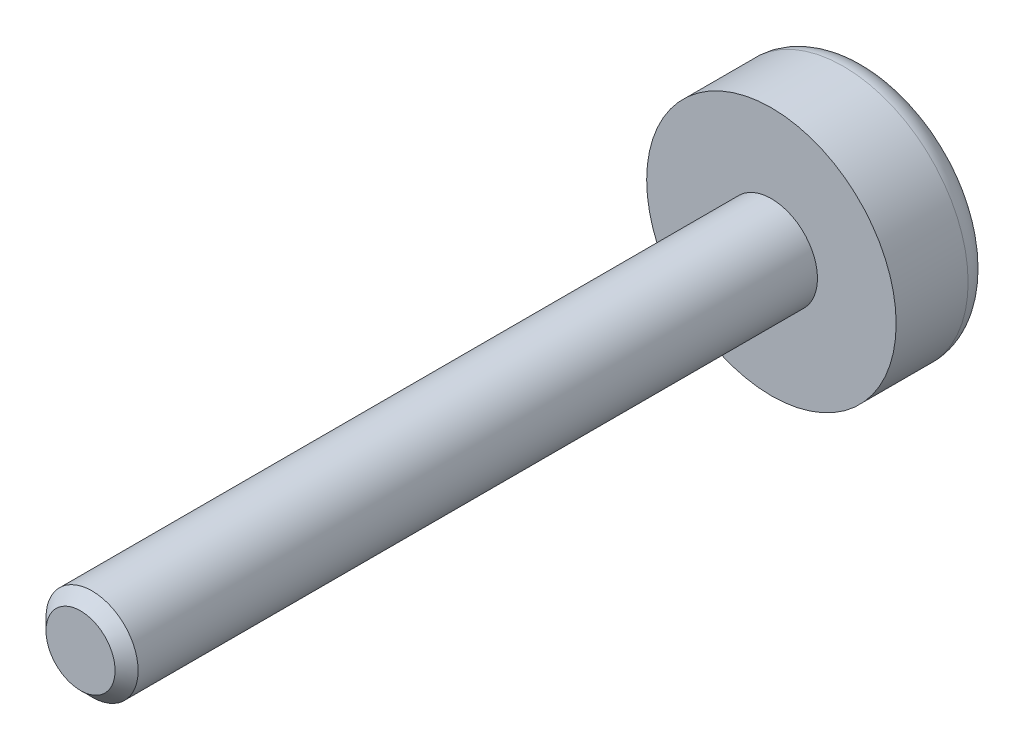
ISO-10303-21;
HEADER;
FILE_DESCRIPTION(('STEP AP214'),'2;1');
FILE_NAME('part.step','',(''),(''),'','','');
FILE_SCHEMA(('AUTOMOTIVE_DESIGN { 1 0 10303 214 1 1 1 1 }'));
ENDSEC;
DATA;
#1=APPLICATION_CONTEXT('core data for automotive mechanical design processes');
#2=APPLICATION_PROTOCOL_DEFINITION('international standard','automotive_design',2000,#1);
#3=PRODUCT_CONTEXT('',#1,'mechanical');
#4=PRODUCT('Part','Part','',(#3));
#5=PRODUCT_RELATED_PRODUCT_CATEGORY('part','',(#4));
#6=PRODUCT_DEFINITION_FORMATION('','',#4);
#7=PRODUCT_DEFINITION_CONTEXT('part definition',#1,'design');
#8=PRODUCT_DEFINITION('design','',#6,#7);
#9=PRODUCT_DEFINITION_SHAPE('','',#8);
#10=(LENGTH_UNIT() NAMED_UNIT(*) SI_UNIT(.MILLI.,.METRE.));
#11=(NAMED_UNIT(*) PLANE_ANGLE_UNIT() SI_UNIT($,.RADIAN.));
#12=(NAMED_UNIT(*) SI_UNIT($,.STERADIAN.) SOLID_ANGLE_UNIT());
#13=UNCERTAINTY_MEASURE_WITH_UNIT(LENGTH_MEASURE(1.E-05),#10,'distance_accuracy_value','');
#14=(GEOMETRIC_REPRESENTATION_CONTEXT(3) GLOBAL_UNCERTAINTY_ASSIGNED_CONTEXT((#13)) GLOBAL_UNIT_ASSIGNED_CONTEXT((#10,
#11,#12)) REPRESENTATION_CONTEXT('',''));
#15=CARTESIAN_POINT('',(0.,0.,0.));
#16=DIRECTION('',(0.,0.,1.));
#17=DIRECTION('',(1.,0.,0.));
#18=AXIS2_PLACEMENT_3D('',#15,#16,#17);
#19=CARTESIAN_POINT('',(0.,0.,18.));
#20=DIRECTION('',(0.,0.,1.));
#21=DIRECTION('',(-1.,0.,0.));
#22=AXIS2_PLACEMENT_3D('',#19,#20,#21);
#23=PLANE('',#22);
#24=CARTESIAN_POINT('',(0.,0.,18.));
#25=DIRECTION('',(0.,0.,-1.));
#26=DIRECTION('',(-1.,0.,0.));
#27=AXIS2_PLACEMENT_3D('',#24,#25,#26);
#28=CIRCLE('',#27,0.900000000000007);
#29=CARTESIAN_POINT('',(-0.900000000000007,0.,18.));
#30=VERTEX_POINT('',#29);
#31=EDGE_CURVE('E140',#30,#30,#28,.T.);
#32=ORIENTED_EDGE('',*,*,#31,.F.);
#33=EDGE_LOOP('',(#32));
#34=FACE_BOUND('',#33,.T.);
#35=ADVANCED_FACE('F41',(#34),#23,.T.);
#36=CARTESIAN_POINT('',(0.,0.,-10.123));
#37=DIRECTION('',(0.,0.,-1.));
#38=DIRECTION('',(1.,0.,0.));
#39=AXIS2_PLACEMENT_3D('',#36,#37,#38);
#40=CYLINDRICAL_SURFACE('',#39,1.2);
#41=CARTESIAN_POINT('',(0.,0.,17.7));
#42=DIRECTION('',(0.,0.,-1.));
#43=DIRECTION('',(-1.,0.,0.));
#44=AXIS2_PLACEMENT_3D('',#41,#42,#43);
#45=CIRCLE('',#44,1.2);
#46=CARTESIAN_POINT('',(-1.2,0.,17.7));
#47=VERTEX_POINT('',#46);
#48=EDGE_CURVE('E137',#47,#47,#45,.F.);
#49=ORIENTED_EDGE('',*,*,#48,.F.);
#50=EDGE_LOOP('',(#49));
#51=FACE_BOUND('',#50,.T.);
#52=CARTESIAN_POINT('',(0.,0.,0.));
#53=DIRECTION('',(0.,0.,1.));
#54=DIRECTION('',(1.,0.,0.));
#55=AXIS2_PLACEMENT_3D('',#52,#53,#54);
#56=CIRCLE('',#55,1.2);
#57=CARTESIAN_POINT('',(1.2,0.,0.));
#58=VERTEX_POINT('',#57);
#59=EDGE_CURVE('E134',#58,#58,#56,.T.);
#60=ORIENTED_EDGE('',*,*,#59,.T.);
#61=EDGE_LOOP('',(#60));
#62=FACE_BOUND('',#61,.T.);
#63=ADVANCED_FACE('F163',(#51,#62),#40,.T.);
#64=CARTESIAN_POINT('',(1.2,0.,0.));
#65=DIRECTION('',(0.,0.,1.));
#66=DIRECTION('',(-1.,0.,0.));
#67=AXIS2_PLACEMENT_3D('',#64,#65,#66);
#68=PLANE('',#67);
#69=ORIENTED_EDGE('',*,*,#59,.F.);
#70=EDGE_LOOP('',(#69));
#71=FACE_BOUND('',#70,.T.);
#72=CARTESIAN_POINT('',(0.,0.,0.));
#73=DIRECTION('',(0.,0.,1.));
#74=DIRECTION('',(1.,0.,0.));
#75=AXIS2_PLACEMENT_3D('',#72,#73,#74);
#76=CIRCLE('',#75,3.25);
#77=CARTESIAN_POINT('',(3.25,0.,0.));
#78=VERTEX_POINT('',#77);
#79=EDGE_CURVE('E131',#78,#78,#76,.T.);
#80=ORIENTED_EDGE('',*,*,#79,.T.);
#81=EDGE_LOOP('',(#80));
#82=FACE_BOUND('',#81,.T.);
#83=ADVANCED_FACE('F157',(#71,#82),#68,.T.);
#84=CARTESIAN_POINT('',(0.,0.,-10.123));
#85=DIRECTION('',(0.,0.,-1.));
#86=DIRECTION('',(1.,0.,0.));
#87=AXIS2_PLACEMENT_3D('',#84,#85,#86);
#88=CYLINDRICAL_SURFACE('',#87,3.25);
#89=CARTESIAN_POINT('',(0.,0.,-1.875));
#90=DIRECTION('',(0.,0.,1.));
#91=DIRECTION('',(1.,0.,0.));
#92=AXIS2_PLACEMENT_3D('',#89,#90,#91);
#93=CIRCLE('',#92,3.25);
#94=CARTESIAN_POINT('',(3.25,0.,-1.875));
#95=VERTEX_POINT('',#94);
#96=EDGE_CURVE('E11',#95,#95,#93,.F.);
#97=ORIENTED_EDGE('',*,*,#96,.F.);
#98=EDGE_LOOP('',(#97));
#99=FACE_BOUND('',#98,.T.);
#100=ORIENTED_EDGE('',*,*,#79,.F.);
#101=EDGE_LOOP('',(#100));
#102=FACE_BOUND('',#101,.T.);
#103=ADVANCED_FACE('F149',(#99,#102),#88,.T.);
#104=CARTESIAN_POINT('',(3.25,0.,-2.5));
#105=DIRECTION('',(0.,0.,-1.));
#106=DIRECTION('',(1.,0.,0.));
#107=AXIS2_PLACEMENT_3D('',#104,#105,#106);
#108=PLANE('',#107);
#109=DIRECTION('',(0.499999999999995,0.866025403784441,0.));
#110=VECTOR('',#109,1.);
#111=CARTESIAN_POINT('',(0.577350269189637,-0.999999999999993,-2.5));
#112=LINE('',#111,#110);
#113=CARTESIAN_POINT('',(0.577350269189637,-0.999999999999993,-2.5));
#114=VERTEX_POINT('',#113);
#115=CARTESIAN_POINT('',(1.15470053837925,0.,-2.5));
#116=VERTEX_POINT('',#115);
#117=EDGE_CURVE('E315',#114,#116,#112,.T.);
#118=ORIENTED_EDGE('',*,*,#117,.T.);
#119=DIRECTION('',(-0.500000000000001,0.866025403784438,0.));
#120=VECTOR('',#119,1.);
#121=CARTESIAN_POINT('',(1.15470053837925,0.,-2.5));
#122=LINE('',#121,#120);
#123=CARTESIAN_POINT('',(0.577350269189624,1.,-2.5));
#124=VERTEX_POINT('',#123);
#125=EDGE_CURVE('E310',#116,#124,#122,.T.);
#126=ORIENTED_EDGE('',*,*,#125,.T.);
#127=DIRECTION('',(-1.,0.,0.));
#128=VECTOR('',#127,1.);
#129=CARTESIAN_POINT('',(0.577350269189624,1.,-2.5));
#130=LINE('',#129,#128);
#131=CARTESIAN_POINT('',(-0.57735026918963,0.999999999999998,-2.5));
#132=VERTEX_POINT('',#131);
#133=EDGE_CURVE('E314',#124,#132,#130,.T.);
#134=ORIENTED_EDGE('',*,*,#133,.T.);
#135=DIRECTION('',(-0.499999999999995,-0.866025403784442,0.));
#136=VECTOR('',#135,1.);
#137=CARTESIAN_POINT('',(-0.57735026918963,0.999999999999998,-2.5));
#138=LINE('',#137,#136);
#139=CARTESIAN_POINT('',(-1.15470053837925,0.,-2.5));
#140=VERTEX_POINT('',#139);
#141=EDGE_CURVE('E322',#132,#140,#138,.T.);
#142=ORIENTED_EDGE('',*,*,#141,.T.);
#143=DIRECTION('',(0.500000000000007,-0.866025403784434,0.));
#144=VECTOR('',#143,1.);
#145=CARTESIAN_POINT('',(-1.15470053837925,0.,-2.5));
#146=LINE('',#145,#144);
#147=CARTESIAN_POINT('',(-0.577350269189617,-1.00000000000001,-2.5));
#148=VERTEX_POINT('',#147);
#149=EDGE_CURVE('E120',#140,#148,#146,.T.);
#150=ORIENTED_EDGE('',*,*,#149,.T.);
#151=DIRECTION('',(1.,0.,0.));
#152=VECTOR('',#151,1.);
#153=CARTESIAN_POINT('',(-0.577350269189617,-1.00000000000001,-2.5));
#154=LINE('',#153,#152);
#155=EDGE_CURVE('E317',#148,#114,#154,.T.);
#156=ORIENTED_EDGE('',*,*,#155,.T.);
#157=EDGE_LOOP('',(#118,#126,#134,#142,#150,#156));
#158=FACE_BOUND('',#157,.T.);
#159=CARTESIAN_POINT('',(0.,0.,-2.5));
#160=DIRECTION('',(0.,0.,1.));
#161=DIRECTION('',(1.,0.,0.));
#162=AXIS2_PLACEMENT_3D('',#159,#160,#161);
#163=CIRCLE('',#162,2.625);
#164=CARTESIAN_POINT('',(2.625,0.,-2.5));
#165=VERTEX_POINT('',#164);
#166=EDGE_CURVE('E49',#165,#165,#163,.T.);
#167=ORIENTED_EDGE('',*,*,#166,.F.);
#168=EDGE_LOOP('',(#167));
#169=FACE_BOUND('',#168,.T.);
#170=ADVANCED_FACE('F146',(#158,#169),#108,.T.);
#171=CARTESIAN_POINT('',(0.,0.,17.7));
#172=DIRECTION('',(0.,0.,-1.));
#173=DIRECTION('',(1.,0.,0.));
#174=AXIS2_PLACEMENT_3D('',#171,#172,#173);
#175=CONICAL_SURFACE('',#174,1.2,0.785398163397446);
#176=ORIENTED_EDGE('',*,*,#31,.T.);
#177=EDGE_LOOP('',(#176));
#178=FACE_BOUND('',#177,.T.);
#179=ORIENTED_EDGE('',*,*,#48,.T.);
#180=EDGE_LOOP('',(#179));
#181=FACE_BOUND('',#180,.T.);
#182=ADVANCED_FACE('F148',(#178,#181),#175,.T.);
#183=CARTESIAN_POINT('',(0.,0.,-1.875));
#184=DIRECTION('',(0.,0.,-1.));
#185=DIRECTION('',(1.,0.,0.));
#186=AXIS2_PLACEMENT_3D('',#183,#184,#185);
#187=TOROIDAL_SURFACE('',#186,2.625,0.625);
#188=ORIENTED_EDGE('',*,*,#96,.T.);
#189=EDGE_LOOP('',(#188));
#190=FACE_BOUND('',#189,.T.);
#191=ORIENTED_EDGE('',*,*,#166,.T.);
#192=EDGE_LOOP('',(#191));
#193=FACE_BOUND('',#192,.T.);
#194=ADVANCED_FACE('F43',(#190,#193),#187,.T.);
#195=CARTESIAN_POINT('',(0.577350269189637,-0.999999999999993,-1.125));
#196=DIRECTION('',(0.866025403784441,-0.499999999999995,0.));
#197=DIRECTION('',(0.499999999999995,0.866025403784441,0.));
#198=AXIS2_PLACEMENT_3D('',#195,#196,#197);
#199=PLANE('',#198);
#200=ORIENTED_EDGE('',*,*,#117,.F.);
#201=DIRECTION('',(0.,0.,-1.));
#202=VECTOR('',#201,1.);
#203=CARTESIAN_POINT('',(0.577350269189637,-0.999999999999993,-1.125));
#204=LINE('',#203,#202);
#205=CARTESIAN_POINT('',(0.577350269189637,-0.999999999999993,-1.125));
#206=VERTEX_POINT('',#205);
#207=EDGE_CURVE('E87',#206,#114,#204,.T.);
#208=ORIENTED_EDGE('',*,*,#207,.F.);
#209=DIRECTION('',(0.499999999999995,0.866025403784441,0.));
#210=VECTOR('',#209,1.);
#211=CARTESIAN_POINT('',(0.577350269189637,-0.999999999999993,-1.125));
#212=LINE('',#211,#210);
#213=CARTESIAN_POINT('',(1.15470053837925,0.,-1.125));
#214=VERTEX_POINT('',#213);
#215=EDGE_CURVE('E325',#206,#214,#212,.T.);
#216=ORIENTED_EDGE('',*,*,#215,.T.);
#217=DIRECTION('',(0.,0.,-1.));
#218=VECTOR('',#217,1.);
#219=CARTESIAN_POINT('',(1.15470053837925,0.,-1.125));
#220=LINE('',#219,#218);
#221=EDGE_CURVE('E56',#214,#116,#220,.T.);
#222=ORIENTED_EDGE('',*,*,#221,.T.);
#223=EDGE_LOOP('',(#200,#208,#216,#222));
#224=FACE_BOUND('',#223,.T.);
#225=ADVANCED_FACE('F210',(#224),#199,.F.);
#226=CARTESIAN_POINT('',(-0.577350269189617,-1.00000000000001,-1.125));
#227=DIRECTION('',(0.,-1.,0.));
#228=DIRECTION('',(1.,0.,0.));
#229=AXIS2_PLACEMENT_3D('',#226,#227,#228);
#230=PLANE('',#229);
#231=ORIENTED_EDGE('',*,*,#155,.F.);
#232=DIRECTION('',(0.,0.,-1.));
#233=VECTOR('',#232,1.);
#234=CARTESIAN_POINT('',(-0.577350269189617,-1.00000000000001,-1.125));
#235=LINE('',#234,#233);
#236=CARTESIAN_POINT('',(-0.577350269189617,-1.00000000000001,-1.125));
#237=VERTEX_POINT('',#236);
#238=EDGE_CURVE('E122',#237,#148,#235,.T.);
#239=ORIENTED_EDGE('',*,*,#238,.F.);
#240=DIRECTION('',(1.,0.,0.));
#241=VECTOR('',#240,1.);
#242=CARTESIAN_POINT('',(-0.577350269189617,-1.00000000000001,-1.125));
#243=LINE('',#242,#241);
#244=EDGE_CURVE('E65',#237,#206,#243,.T.);
#245=ORIENTED_EDGE('',*,*,#244,.T.);
#246=ORIENTED_EDGE('',*,*,#207,.T.);
#247=EDGE_LOOP('',(#231,#239,#245,#246));
#248=FACE_BOUND('',#247,.T.);
#249=ADVANCED_FACE('F220',(#248),#230,.F.);
#250=CARTESIAN_POINT('',(-1.15470053837925,0.,-1.125));
#251=DIRECTION('',(-0.866025403784435,-0.500000000000007,0.));
#252=DIRECTION('',(0.500000000000007,-0.866025403784435,0.));
#253=AXIS2_PLACEMENT_3D('',#250,#251,#252);
#254=PLANE('',#253);
#255=ORIENTED_EDGE('',*,*,#149,.F.);
#256=DIRECTION('',(0.,0.,-1.));
#257=VECTOR('',#256,1.);
#258=CARTESIAN_POINT('',(-1.15470053837925,0.,-1.125));
#259=LINE('',#258,#257);
#260=CARTESIAN_POINT('',(-1.15470053837925,0.,-1.125));
#261=VERTEX_POINT('',#260);
#262=EDGE_CURVE('E109',#261,#140,#259,.T.);
#263=ORIENTED_EDGE('',*,*,#262,.F.);
#264=DIRECTION('',(0.500000000000007,-0.866025403784434,0.));
#265=VECTOR('',#264,1.);
#266=CARTESIAN_POINT('',(-1.15470053837925,0.,-1.125));
#267=LINE('',#266,#265);
#268=EDGE_CURVE('E112',#261,#237,#267,.T.);
#269=ORIENTED_EDGE('',*,*,#268,.T.);
#270=ORIENTED_EDGE('',*,*,#238,.T.);
#271=EDGE_LOOP('',(#255,#263,#269,#270));
#272=FACE_BOUND('',#271,.T.);
#273=ADVANCED_FACE('F118',(#272),#254,.F.);
#274=CARTESIAN_POINT('',(-0.57735026918963,0.999999999999998,-1.125));
#275=DIRECTION('',(-0.866025403784442,0.499999999999995,0.));
#276=DIRECTION('',(-0.499999999999995,-0.866025403784441,0.));
#277=AXIS2_PLACEMENT_3D('',#274,#275,#276);
#278=PLANE('',#277);
#279=ORIENTED_EDGE('',*,*,#141,.F.);
#280=DIRECTION('',(0.,0.,-1.));
#281=VECTOR('',#280,1.);
#282=CARTESIAN_POINT('',(-0.57735026918963,0.999999999999998,-1.125));
#283=LINE('',#282,#281);
#284=CARTESIAN_POINT('',(-0.57735026918963,0.999999999999998,-1.125));
#285=VERTEX_POINT('',#284);
#286=EDGE_CURVE('E111',#285,#132,#283,.T.);
#287=ORIENTED_EDGE('',*,*,#286,.F.);
#288=DIRECTION('',(-0.499999999999995,-0.866025403784442,0.));
#289=VECTOR('',#288,1.);
#290=CARTESIAN_POINT('',(-0.57735026918963,0.999999999999998,-1.125));
#291=LINE('',#290,#289);
#292=EDGE_CURVE('E104',#285,#261,#291,.T.);
#293=ORIENTED_EDGE('',*,*,#292,.T.);
#294=ORIENTED_EDGE('',*,*,#262,.T.);
#295=EDGE_LOOP('',(#279,#287,#293,#294));
#296=FACE_BOUND('',#295,.T.);
#297=ADVANCED_FACE('F107',(#296),#278,.F.);
#298=CARTESIAN_POINT('',(0.577350269189624,1.,-1.125));
#299=DIRECTION('',(0.,1.,0.));
#300=DIRECTION('',(-1.,0.,0.));
#301=AXIS2_PLACEMENT_3D('',#298,#299,#300);
#302=PLANE('',#301);
#303=ORIENTED_EDGE('',*,*,#133,.F.);
#304=DIRECTION('',(0.,0.,-1.));
#305=VECTOR('',#304,1.);
#306=CARTESIAN_POINT('',(0.577350269189624,1.,-1.125));
#307=LINE('',#306,#305);
#308=CARTESIAN_POINT('',(0.577350269189624,1.,-1.125));
#309=VERTEX_POINT('',#308);
#310=EDGE_CURVE('E125',#309,#124,#307,.T.);
#311=ORIENTED_EDGE('',*,*,#310,.F.);
#312=DIRECTION('',(-1.,0.,0.));
#313=VECTOR('',#312,1.);
#314=CARTESIAN_POINT('',(0.577350269189624,1.,-1.125));
#315=LINE('',#314,#313);
#316=EDGE_CURVE('E113',#309,#285,#315,.T.);
#317=ORIENTED_EDGE('',*,*,#316,.T.);
#318=ORIENTED_EDGE('',*,*,#286,.T.);
#319=EDGE_LOOP('',(#303,#311,#317,#318));
#320=FACE_BOUND('',#319,.T.);
#321=ADVANCED_FACE('F247',(#320),#302,.F.);
#322=CARTESIAN_POINT('',(1.15470053837925,0.,-1.125));
#323=DIRECTION('',(0.866025403784438,0.500000000000001,0.));
#324=DIRECTION('',(-0.500000000000001,0.866025403784438,0.));
#325=AXIS2_PLACEMENT_3D('',#322,#323,#324);
#326=PLANE('',#325);
#327=ORIENTED_EDGE('',*,*,#125,.F.);
#328=ORIENTED_EDGE('',*,*,#221,.F.);
#329=DIRECTION('',(-0.500000000000001,0.866025403784438,0.));
#330=VECTOR('',#329,1.);
#331=CARTESIAN_POINT('',(1.15470053837925,0.,-1.125));
#332=LINE('',#331,#330);
#333=EDGE_CURVE('E95',#214,#309,#332,.T.);
#334=ORIENTED_EDGE('',*,*,#333,.T.);
#335=ORIENTED_EDGE('',*,*,#310,.T.);
#336=EDGE_LOOP('',(#327,#328,#334,#335));
#337=FACE_BOUND('',#336,.T.);
#338=ADVANCED_FACE('F257',(#337),#326,.F.);
#339=CARTESIAN_POINT('',(0.,0.,-1.125));
#340=DIRECTION('',(0.,0.,-1.));
#341=DIRECTION('',(1.,0.,0.));
#342=AXIS2_PLACEMENT_3D('',#339,#340,#341);
#343=PLANE('',#342);
#344=ORIENTED_EDGE('',*,*,#215,.F.);
#345=ORIENTED_EDGE('',*,*,#244,.F.);
#346=ORIENTED_EDGE('',*,*,#268,.F.);
#347=ORIENTED_EDGE('',*,*,#292,.F.);
#348=ORIENTED_EDGE('',*,*,#316,.F.);
#349=ORIENTED_EDGE('',*,*,#333,.F.);
#350=EDGE_LOOP('',(#344,#345,#346,#347,#348,#349));
#351=FACE_BOUND('',#350,.T.);
#352=ADVANCED_FACE('F115',(#351),#343,.T.);
#353=CLOSED_SHELL('',(#35,#63,#83,#103,#170,#182,#194,#225,#249,#273,#297,#321,#338,#352));
#354=MANIFOLD_SOLID_BREP('B2',#353);
#355=ADVANCED_BREP_SHAPE_REPRESENTATION('',(#18,#354),#14);
#356=SHAPE_DEFINITION_REPRESENTATION(#9,#355);
ENDSEC;
END-ISO-10303-21;
